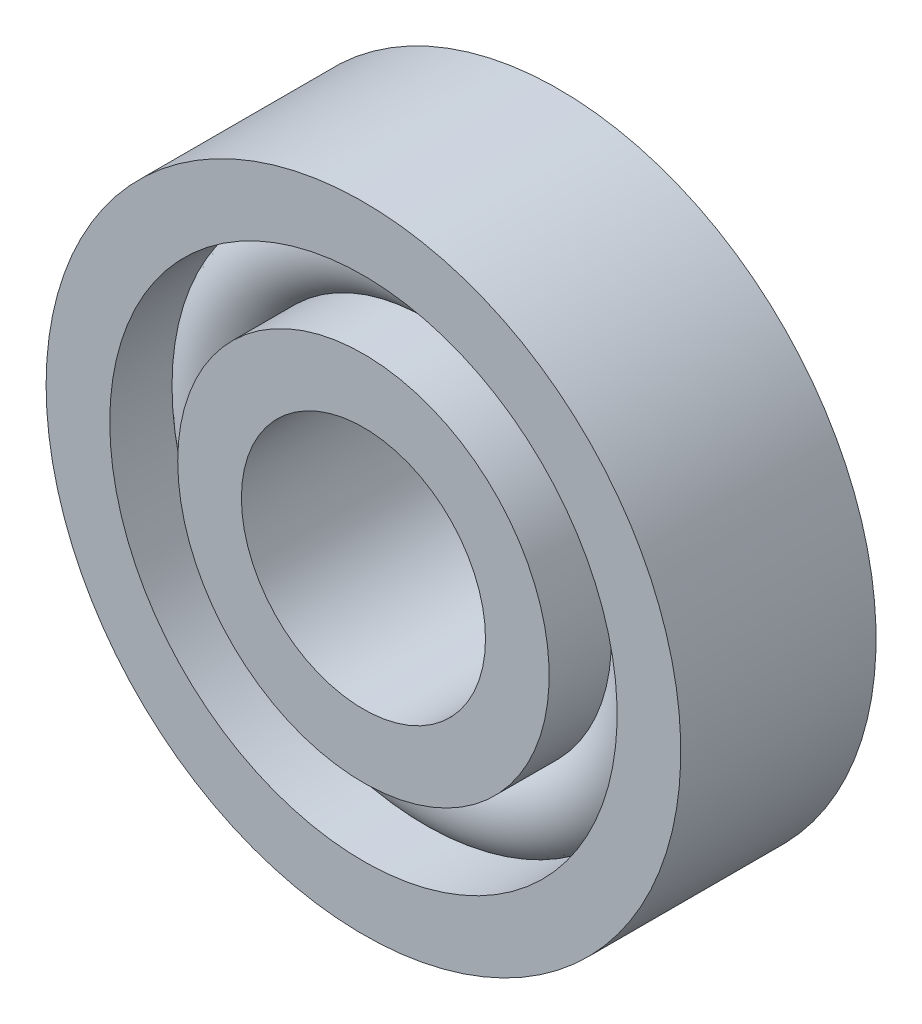
ISO-10303-21;
HEADER;
FILE_DESCRIPTION(('STEP AP214'),'2;1');
FILE_NAME('part.step','',(''),(''),'','','');
FILE_SCHEMA(('AUTOMOTIVE_DESIGN { 1 0 10303 214 1 1 1 1 }'));
ENDSEC;
DATA;
#1=APPLICATION_CONTEXT('core data for automotive mechanical design processes');
#2=APPLICATION_PROTOCOL_DEFINITION('international standard','automotive_design',2000,#1);
#3=PRODUCT_CONTEXT('',#1,'mechanical');
#4=PRODUCT('Part','Part','',(#3));
#5=PRODUCT_RELATED_PRODUCT_CATEGORY('part','',(#4));
#6=PRODUCT_DEFINITION_FORMATION('','',#4);
#7=PRODUCT_DEFINITION_CONTEXT('part definition',#1,'design');
#8=PRODUCT_DEFINITION('design','',#6,#7);
#9=PRODUCT_DEFINITION_SHAPE('','',#8);
#10=(LENGTH_UNIT() NAMED_UNIT(*) SI_UNIT(.MILLI.,.METRE.));
#11=(NAMED_UNIT(*) PLANE_ANGLE_UNIT() SI_UNIT($,.RADIAN.));
#12=(NAMED_UNIT(*) SI_UNIT($,.STERADIAN.) SOLID_ANGLE_UNIT());
#13=UNCERTAINTY_MEASURE_WITH_UNIT(LENGTH_MEASURE(1.E-05),#10,'distance_accuracy_value','');
#14=(GEOMETRIC_REPRESENTATION_CONTEXT(3) GLOBAL_UNCERTAINTY_ASSIGNED_CONTEXT((#13)) GLOBAL_UNIT_ASSIGNED_CONTEXT((#10,
#11,#12)) REPRESENTATION_CONTEXT('',''));
#15=CARTESIAN_POINT('',(0.,0.,0.));
#16=DIRECTION('',(0.,0.,1.));
#17=DIRECTION('',(1.,0.,0.));
#18=AXIS2_PLACEMENT_3D('',#15,#16,#17);
#19=CARTESIAN_POINT('',(0.,0.,4.4));
#20=DIRECTION('',(0.,0.,-1.));
#21=DIRECTION('',(-1.,0.,0.));
#22=AXIS2_PLACEMENT_3D('',#19,#20,#21);
#23=CYLINDRICAL_SURFACE('',#22,5.);
#24=CARTESIAN_POINT('',(0.,0.,-4.));
#25=DIRECTION('',(0.,0.,-1.));
#26=DIRECTION('',(-1.,0.,0.));
#27=AXIS2_PLACEMENT_3D('',#24,#25,#26);
#28=CIRCLE('',#27,5.);
#29=CARTESIAN_POINT('',(-5.,0.,-4.));
#30=VERTEX_POINT('',#29);
#31=EDGE_CURVE('E45',#30,#30,#28,.F.);
#32=ORIENTED_EDGE('',*,*,#31,.F.);
#33=EDGE_LOOP('',(#32));
#34=FACE_BOUND('',#33,.T.);
#35=CARTESIAN_POINT('',(0.,0.,4.));
#36=DIRECTION('',(0.,0.,-1.));
#37=DIRECTION('',(-1.,0.,0.));
#38=AXIS2_PLACEMENT_3D('',#35,#36,#37);
#39=CIRCLE('',#38,5.);
#40=CARTESIAN_POINT('',(-5.,0.,4.));
#41=VERTEX_POINT('',#40);
#42=EDGE_CURVE('E19',#41,#41,#39,.F.);
#43=ORIENTED_EDGE('',*,*,#42,.T.);
#44=EDGE_LOOP('',(#43));
#45=FACE_BOUND('',#44,.T.);
#46=ADVANCED_FACE('F16',(#34,#45),#23,.F.);
#47=CARTESIAN_POINT('',(0.,0.,4.));
#48=DIRECTION('',(0.,0.,-1.));
#49=DIRECTION('',(-1.,0.,0.));
#50=AXIS2_PLACEMENT_3D('',#47,#48,#49);
#51=PLANE('',#50);
#52=ORIENTED_EDGE('',*,*,#42,.F.);
#53=EDGE_LOOP('',(#52));
#54=FACE_BOUND('',#53,.T.);
#55=CARTESIAN_POINT('',(0.,0.,4.));
#56=DIRECTION('',(0.,0.,-1.));
#57=DIRECTION('',(-1.,0.,0.));
#58=AXIS2_PLACEMENT_3D('',#55,#56,#57);
#59=CIRCLE('',#58,7.608);
#60=CARTESIAN_POINT('',(-7.608,0.,4.));
#61=VERTEX_POINT('',#60);
#62=EDGE_CURVE('E43',#61,#61,#59,.T.);
#63=ORIENTED_EDGE('',*,*,#62,.F.);
#64=EDGE_LOOP('',(#63));
#65=FACE_BOUND('',#64,.T.);
#66=ADVANCED_FACE('F53',(#54,#65),#51,.F.);
#67=CARTESIAN_POINT('',(0.,0.,-4.));
#68=DIRECTION('',(0.,0.,-1.));
#69=DIRECTION('',(-1.,0.,0.));
#70=AXIS2_PLACEMENT_3D('',#67,#68,#69);
#71=PLANE('',#70);
#72=ORIENTED_EDGE('',*,*,#31,.T.);
#73=EDGE_LOOP('',(#72));
#74=FACE_BOUND('',#73,.T.);
#75=CARTESIAN_POINT('',(0.,0.,-4.));
#76=DIRECTION('',(0.,0.,-1.));
#77=DIRECTION('',(-1.,0.,0.));
#78=AXIS2_PLACEMENT_3D('',#75,#76,#77);
#79=CIRCLE('',#78,7.608);
#80=CARTESIAN_POINT('',(-7.608,0.,-4.));
#81=VERTEX_POINT('',#80);
#82=EDGE_CURVE('E40',#81,#81,#79,.F.);
#83=ORIENTED_EDGE('',*,*,#82,.F.);
#84=EDGE_LOOP('',(#83));
#85=FACE_BOUND('',#84,.T.);
#86=ADVANCED_FACE('F56',(#74,#85),#71,.T.);
#87=CARTESIAN_POINT('',(0.,0.,4.4));
#88=DIRECTION('',(0.,0.,-1.));
#89=DIRECTION('',(-1.,0.,0.));
#90=AXIS2_PLACEMENT_3D('',#87,#88,#89);
#91=CYLINDRICAL_SURFACE('',#90,7.608);
#92=ORIENTED_EDGE('',*,*,#62,.T.);
#93=EDGE_LOOP('',(#92));
#94=FACE_BOUND('',#93,.T.);
#95=CARTESIAN_POINT('',(0.,0.,1.44997793086676));
#96=DIRECTION('',(0.,0.,-1.));
#97=DIRECTION('',(0.,-1.,0.));
#98=AXIS2_PLACEMENT_3D('',#95,#96,#97);
#99=CIRCLE('',#98,7.60800000000023);
#100=CARTESIAN_POINT('',(0.,-7.60800000000023,1.44997793086676));
#101=VERTEX_POINT('',#100);
#102=EDGE_CURVE('E31',#101,#101,#99,.T.);
#103=ORIENTED_EDGE('',*,*,#102,.F.);
#104=EDGE_LOOP('',(#103));
#105=FACE_BOUND('',#104,.T.);
#106=ADVANCED_FACE('F59',(#94,#105),#91,.T.);
#107=CARTESIAN_POINT('',(0.,0.,4.4));
#108=DIRECTION('',(0.,0.,-1.));
#109=DIRECTION('',(-1.,0.,0.));
#110=AXIS2_PLACEMENT_3D('',#107,#108,#109);
#111=CYLINDRICAL_SURFACE('',#110,7.608);
#112=CARTESIAN_POINT('',(0.,0.,-1.44997793086676));
#113=DIRECTION('',(0.,0.,-1.));
#114=DIRECTION('',(0.,-1.,0.));
#115=AXIS2_PLACEMENT_3D('',#112,#113,#114);
#116=CIRCLE('',#115,7.60800000000023);
#117=CARTESIAN_POINT('',(0.,-7.60800000000023,-1.44997793086676));
#118=VERTEX_POINT('',#117);
#119=EDGE_CURVE('E67',#118,#118,#116,.F.);
#120=ORIENTED_EDGE('',*,*,#119,.F.);
#121=EDGE_LOOP('',(#120));
#122=FACE_BOUND('',#121,.T.);
#123=ORIENTED_EDGE('',*,*,#82,.T.);
#124=EDGE_LOOP('',(#123));
#125=FACE_BOUND('',#124,.T.);
#126=ADVANCED_FACE('F62',(#122,#125),#111,.T.);
#127=CARTESIAN_POINT('',(0.,0.,0.));
#128=DIRECTION('',(0.,0.,-1.));
#129=DIRECTION('',(0.,-1.,0.));
#130=AXIS2_PLACEMENT_3D('',#127,#128,#129);
#131=TOROIDAL_SURFACE('',#130,9.,2.01);
#132=ORIENTED_EDGE('',*,*,#102,.T.);
#133=EDGE_LOOP('',(#132));
#134=FACE_BOUND('',#133,.T.);
#135=CARTESIAN_POINT('',(0.,0.,1.449977930867));
#136=DIRECTION('',(0.,0.,-1.));
#137=DIRECTION('',(-1.,0.,0.));
#138=AXIS2_PLACEMENT_3D('',#135,#136,#137);
#139=CIRCLE('',#138,10.392);
#140=CARTESIAN_POINT('',(-10.392,0.,1.449977930867));
#141=VERTEX_POINT('',#140);
#142=EDGE_CURVE('E69',#141,#141,#139,.F.);
#143=ORIENTED_EDGE('',*,*,#142,.T.);
#144=EDGE_LOOP('',(#143));
#145=FACE_BOUND('',#144,.T.);
#146=ADVANCED_FACE('F78',(#134,#145),#131,.T.);
#147=CARTESIAN_POINT('',(0.,0.,0.));
#148=DIRECTION('',(0.,0.,-1.));
#149=DIRECTION('',(0.,-1.,0.));
#150=AXIS2_PLACEMENT_3D('',#147,#148,#149);
#151=TOROIDAL_SURFACE('',#150,9.,2.01);
#152=CARTESIAN_POINT('',(0.,0.,-1.449977930867));
#153=DIRECTION('',(0.,0.,-1.));
#154=DIRECTION('',(-1.,0.,0.));
#155=AXIS2_PLACEMENT_3D('',#152,#153,#154);
#156=CIRCLE('',#155,10.392);
#157=CARTESIAN_POINT('',(-10.392,0.,-1.449977930867));
#158=VERTEX_POINT('',#157);
#159=EDGE_CURVE('E39',#158,#158,#156,.T.);
#160=ORIENTED_EDGE('',*,*,#159,.T.);
#161=EDGE_LOOP('',(#160));
#162=FACE_BOUND('',#161,.T.);
#163=ORIENTED_EDGE('',*,*,#119,.T.);
#164=EDGE_LOOP('',(#163));
#165=FACE_BOUND('',#164,.T.);
#166=ADVANCED_FACE('F82',(#162,#165),#151,.T.);
#167=CARTESIAN_POINT('',(0.,0.,4.4));
#168=DIRECTION('',(0.,0.,-1.));
#169=DIRECTION('',(-1.,0.,0.));
#170=AXIS2_PLACEMENT_3D('',#167,#168,#169);
#171=CYLINDRICAL_SURFACE('',#170,10.392);
#172=ORIENTED_EDGE('',*,*,#142,.F.);
#173=EDGE_LOOP('',(#172));
#174=FACE_BOUND('',#173,.T.);
#175=CARTESIAN_POINT('',(0.,0.,4.));
#176=DIRECTION('',(0.,0.,-1.));
#177=DIRECTION('',(-1.,0.,0.));
#178=AXIS2_PLACEMENT_3D('',#175,#176,#177);
#179=CIRCLE('',#178,10.392);
#180=CARTESIAN_POINT('',(-10.392,0.,4.));
#181=VERTEX_POINT('',#180);
#182=EDGE_CURVE('E36',#181,#181,#179,.F.);
#183=ORIENTED_EDGE('',*,*,#182,.T.);
#184=EDGE_LOOP('',(#183));
#185=FACE_BOUND('',#184,.T.);
#186=ADVANCED_FACE('F114',(#174,#185),#171,.F.);
#187=CARTESIAN_POINT('',(0.,0.,4.4));
#188=DIRECTION('',(0.,0.,-1.));
#189=DIRECTION('',(-1.,0.,0.));
#190=AXIS2_PLACEMENT_3D('',#187,#188,#189);
#191=CYLINDRICAL_SURFACE('',#190,10.392);
#192=CARTESIAN_POINT('',(0.,0.,-4.));
#193=DIRECTION('',(0.,0.,-1.));
#194=DIRECTION('',(-1.,0.,0.));
#195=AXIS2_PLACEMENT_3D('',#192,#193,#194);
#196=CIRCLE('',#195,10.392);
#197=CARTESIAN_POINT('',(-10.392,0.,-4.));
#198=VERTEX_POINT('',#197);
#199=EDGE_CURVE('E28',#198,#198,#196,.F.);
#200=ORIENTED_EDGE('',*,*,#199,.F.);
#201=EDGE_LOOP('',(#200));
#202=FACE_BOUND('',#201,.T.);
#203=ORIENTED_EDGE('',*,*,#159,.F.);
#204=EDGE_LOOP('',(#203));
#205=FACE_BOUND('',#204,.T.);
#206=ADVANCED_FACE('F111',(#202,#205),#191,.F.);
#207=CARTESIAN_POINT('',(0.,0.,4.));
#208=DIRECTION('',(0.,0.,-1.));
#209=DIRECTION('',(-1.,0.,0.));
#210=AXIS2_PLACEMENT_3D('',#207,#208,#209);
#211=PLANE('',#210);
#212=ORIENTED_EDGE('',*,*,#182,.F.);
#213=EDGE_LOOP('',(#212));
#214=FACE_BOUND('',#213,.T.);
#215=CARTESIAN_POINT('',(0.,0.,4.));
#216=DIRECTION('',(0.,0.,-1.));
#217=DIRECTION('',(-1.,0.,0.));
#218=AXIS2_PLACEMENT_3D('',#215,#216,#217);
#219=CIRCLE('',#218,13.);
#220=CARTESIAN_POINT('',(-13.,0.,4.));
#221=VERTEX_POINT('',#220);
#222=EDGE_CURVE('E23',#221,#221,#219,.T.);
#223=ORIENTED_EDGE('',*,*,#222,.F.);
#224=EDGE_LOOP('',(#223));
#225=FACE_BOUND('',#224,.T.);
#226=ADVANCED_FACE('F101',(#214,#225),#211,.F.);
#227=CARTESIAN_POINT('',(0.,0.,-4.));
#228=DIRECTION('',(0.,0.,-1.));
#229=DIRECTION('',(-1.,0.,0.));
#230=AXIS2_PLACEMENT_3D('',#227,#228,#229);
#231=PLANE('',#230);
#232=ORIENTED_EDGE('',*,*,#199,.T.);
#233=EDGE_LOOP('',(#232));
#234=FACE_BOUND('',#233,.T.);
#235=CARTESIAN_POINT('',(0.,0.,-4.));
#236=DIRECTION('',(0.,0.,-1.));
#237=DIRECTION('',(-1.,0.,0.));
#238=AXIS2_PLACEMENT_3D('',#235,#236,#237);
#239=CIRCLE('',#238,13.);
#240=CARTESIAN_POINT('',(-13.,0.,-4.));
#241=VERTEX_POINT('',#240);
#242=EDGE_CURVE('E10',#241,#241,#239,.F.);
#243=ORIENTED_EDGE('',*,*,#242,.F.);
#244=EDGE_LOOP('',(#243));
#245=FACE_BOUND('',#244,.T.);
#246=ADVANCED_FACE('F95',(#234,#245),#231,.T.);
#247=CARTESIAN_POINT('',(0.,0.,4.4));
#248=DIRECTION('',(0.,0.,-1.));
#249=DIRECTION('',(-1.,0.,0.));
#250=AXIS2_PLACEMENT_3D('',#247,#248,#249);
#251=CYLINDRICAL_SURFACE('',#250,13.);
#252=ORIENTED_EDGE('',*,*,#242,.T.);
#253=EDGE_LOOP('',(#252));
#254=FACE_BOUND('',#253,.T.);
#255=ORIENTED_EDGE('',*,*,#222,.T.);
#256=EDGE_LOOP('',(#255));
#257=FACE_BOUND('',#256,.T.);
#258=ADVANCED_FACE('F93',(#254,#257),#251,.T.);
#259=CLOSED_SHELL('',(#46,#66,#86,#106,#126,#146,#166,#186,#206,#226,#246,#258));
#260=CARTESIAN_POINT('',(0.,0.,0.));
#261=DIRECTION('',(0.,0.,-1.));
#262=DIRECTION('',(0.,-1.,0.));
#263=AXIS2_PLACEMENT_3D('',#260,#261,#262);
#264=TOROIDAL_SURFACE('',#263,9.,2.);
#265=ADVANCED_FACE('F106',(),#264,.F.);
#266=CLOSED_SHELL('',(#265));
#267=ORIENTED_CLOSED_SHELL('',*,#266,.T.);
#268=BREP_WITH_VOIDS('B1',#259,(#267));
#269=ADVANCED_BREP_SHAPE_REPRESENTATION('',(#18,#268),#14);
#270=SHAPE_DEFINITION_REPRESENTATION(#9,#269);
ENDSEC;
END-ISO-10303-21;
